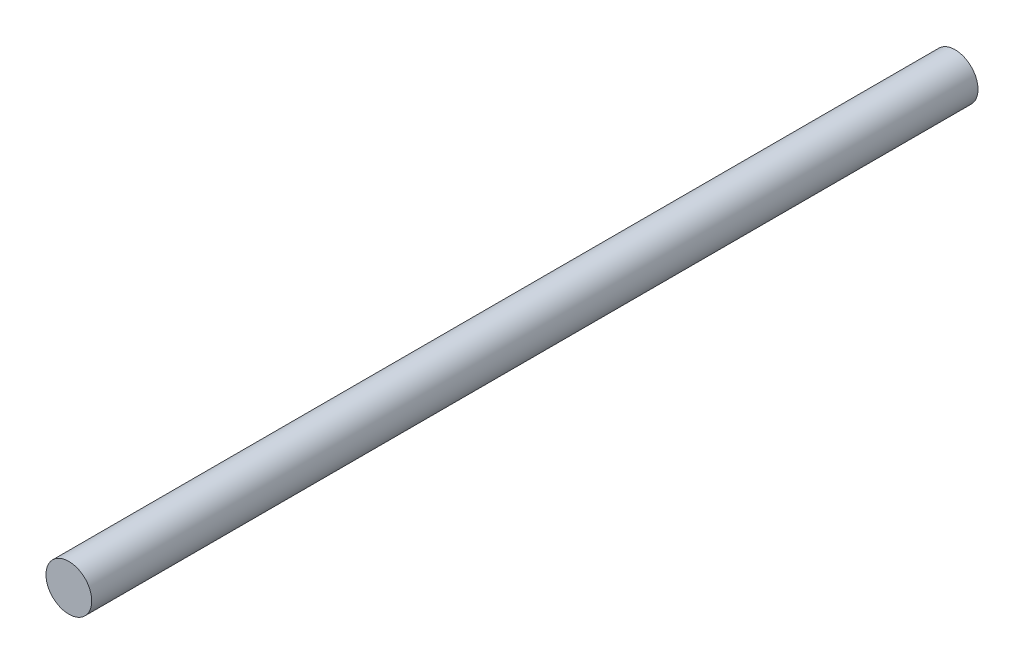
ISO-10303-21;
HEADER;
FILE_DESCRIPTION(('STEP AP214'),'2;1');
FILE_NAME('part.step','',(''),(''),'','','');
FILE_SCHEMA(('AUTOMOTIVE_DESIGN { 1 0 10303 214 1 1 1 1 }'));
ENDSEC;
DATA;
#1=APPLICATION_CONTEXT('core data for automotive mechanical design processes');
#2=APPLICATION_PROTOCOL_DEFINITION('international standard','automotive_design',2000,#1);
#3=PRODUCT_CONTEXT('',#1,'mechanical');
#4=PRODUCT('Part','Part','',(#3));
#5=PRODUCT_RELATED_PRODUCT_CATEGORY('part','',(#4));
#6=PRODUCT_DEFINITION_FORMATION('','',#4);
#7=PRODUCT_DEFINITION_CONTEXT('part definition',#1,'design');
#8=PRODUCT_DEFINITION('design','',#6,#7);
#9=PRODUCT_DEFINITION_SHAPE('','',#8);
#10=(LENGTH_UNIT() NAMED_UNIT(*) SI_UNIT(.MILLI.,.METRE.));
#11=(NAMED_UNIT(*) PLANE_ANGLE_UNIT() SI_UNIT($,.RADIAN.));
#12=(NAMED_UNIT(*) SI_UNIT($,.STERADIAN.) SOLID_ANGLE_UNIT());
#13=UNCERTAINTY_MEASURE_WITH_UNIT(LENGTH_MEASURE(1.E-05),#10,'distance_accuracy_value','');
#14=(GEOMETRIC_REPRESENTATION_CONTEXT(3) GLOBAL_UNCERTAINTY_ASSIGNED_CONTEXT((#13)) GLOBAL_UNIT_ASSIGNED_CONTEXT((#10,
#11,#12)) REPRESENTATION_CONTEXT('',''));
#15=CARTESIAN_POINT('',(0.,0.,0.));
#16=DIRECTION('',(0.,0.,1.));
#17=DIRECTION('',(1.,0.,0.));
#18=AXIS2_PLACEMENT_3D('',#15,#16,#17);
#19=CARTESIAN_POINT('',(-61.2814593786895,29.6958087367178,1200.));
#20=DIRECTION('',(0.,0.,-1.));
#21=DIRECTION('',(-1.,0.,0.));
#22=AXIS2_PLACEMENT_3D('',#19,#20,#21);
#23=CYLINDRICAL_SURFACE('',#22,31.);
#24=CARTESIAN_POINT('',(-61.2814593786895,29.6958087367178,1200.));
#25=DIRECTION('',(0.,0.,1.));
#26=DIRECTION('',(1.,0.,0.));
#27=AXIS2_PLACEMENT_3D('',#24,#25,#26);
#28=CIRCLE('',#27,31.);
#29=CARTESIAN_POINT('',(-30.2814593786895,29.6958087367178,1200.));
#30=VERTEX_POINT('',#29);
#31=EDGE_CURVE('E10',#30,#30,#28,.T.);
#32=ORIENTED_EDGE('',*,*,#31,.F.);
#33=EDGE_LOOP('',(#32));
#34=FACE_BOUND('',#33,.T.);
#35=CARTESIAN_POINT('',(-61.2814593786895,29.6958087367178,0.));
#36=DIRECTION('',(0.,0.,1.));
#37=DIRECTION('',(1.,0.,0.));
#38=AXIS2_PLACEMENT_3D('',#35,#36,#37);
#39=CIRCLE('',#38,31.);
#40=CARTESIAN_POINT('',(-30.2814593786895,29.6958087367178,0.));
#41=VERTEX_POINT('',#40);
#42=EDGE_CURVE('E34',#41,#41,#39,.T.);
#43=ORIENTED_EDGE('',*,*,#42,.T.);
#44=EDGE_LOOP('',(#43));
#45=FACE_BOUND('',#44,.T.);
#46=ADVANCED_FACE('F31',(#34,#45),#23,.T.);
#47=CARTESIAN_POINT('',(-61.2814593786895,29.6958087367178,1200.));
#48=DIRECTION('',(0.,0.,1.));
#49=DIRECTION('',(1.,0.,0.));
#50=AXIS2_PLACEMENT_3D('',#47,#48,#49);
#51=PLANE('',#50);
#52=ORIENTED_EDGE('',*,*,#31,.T.);
#53=EDGE_LOOP('',(#52));
#54=FACE_BOUND('',#53,.T.);
#55=ADVANCED_FACE('F46',(#54),#51,.T.);
#56=CARTESIAN_POINT('',(-61.2814593786895,29.6958087367178,0.));
#57=DIRECTION('',(0.,0.,1.));
#58=DIRECTION('',(1.,0.,0.));
#59=AXIS2_PLACEMENT_3D('',#56,#57,#58);
#60=PLANE('',#59);
#61=ORIENTED_EDGE('',*,*,#42,.F.);
#62=EDGE_LOOP('',(#61));
#63=FACE_BOUND('',#62,.T.);
#64=ADVANCED_FACE('F44',(#63),#60,.F.);
#65=CLOSED_SHELL('',(#46,#55,#64));
#66=MANIFOLD_SOLID_BREP('B2',#65);
#67=ADVANCED_BREP_SHAPE_REPRESENTATION('',(#18,#66),#14);
#68=SHAPE_DEFINITION_REPRESENTATION(#9,#67);
ENDSEC;
END-ISO-10303-21;
